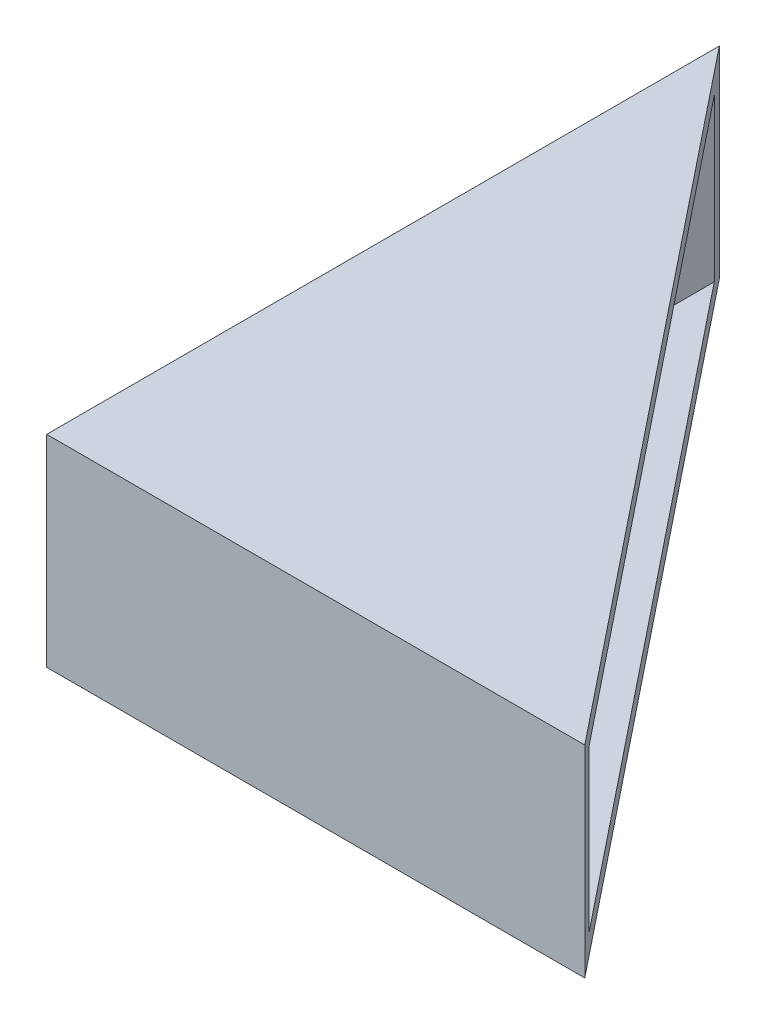
ISO-10303-21;
HEADER;
FILE_DESCRIPTION(('STEP AP214'),'2;1');
FILE_NAME('part.step','',(''),(''),'','','');
FILE_SCHEMA(('AUTOMOTIVE_DESIGN { 1 0 10303 214 1 1 1 1 }'));
ENDSEC;
DATA;
#1=APPLICATION_CONTEXT('core data for automotive mechanical design processes');
#2=APPLICATION_PROTOCOL_DEFINITION('international standard','automotive_design',2000,#1);
#3=PRODUCT_CONTEXT('',#1,'mechanical');
#4=PRODUCT('Part','Part','',(#3));
#5=PRODUCT_RELATED_PRODUCT_CATEGORY('part','',(#4));
#6=PRODUCT_DEFINITION_FORMATION('','',#4);
#7=PRODUCT_DEFINITION_CONTEXT('part definition',#1,'design');
#8=PRODUCT_DEFINITION('design','',#6,#7);
#9=PRODUCT_DEFINITION_SHAPE('','',#8);
#10=(LENGTH_UNIT() NAMED_UNIT(*) SI_UNIT(.MILLI.,.METRE.));
#11=(NAMED_UNIT(*) PLANE_ANGLE_UNIT() SI_UNIT($,.RADIAN.));
#12=(NAMED_UNIT(*) SI_UNIT($,.STERADIAN.) SOLID_ANGLE_UNIT());
#13=UNCERTAINTY_MEASURE_WITH_UNIT(LENGTH_MEASURE(1.E-05),#10,'distance_accuracy_value','');
#14=(GEOMETRIC_REPRESENTATION_CONTEXT(3) GLOBAL_UNCERTAINTY_ASSIGNED_CONTEXT((#13)) GLOBAL_UNIT_ASSIGNED_CONTEXT((#10,
#11,#12)) REPRESENTATION_CONTEXT('',''));
#15=CARTESIAN_POINT('',(0.,0.,0.));
#16=DIRECTION('',(0.,0.,1.));
#17=DIRECTION('',(1.,0.,0.));
#18=AXIS2_PLACEMENT_3D('',#15,#16,#17);
#19=CARTESIAN_POINT('',(80.,30.,0.));
#20=DIRECTION('',(-0.78086880944303,0.,0.624695047554424));
#21=DIRECTION('',(0.624695047554424,0.,0.78086880944303));
#22=AXIS2_PLACEMENT_3D('',#19,#20,#21);
#23=PLANE('',#22);
#24=DIRECTION('',(-0.624695047554424,0.,-0.78086880944303));
#25=VECTOR('',#24,1.);
#26=CARTESIAN_POINT('',(80.,0.,0.));
#27=LINE('',#26,#25);
#28=CARTESIAN_POINT('',(80.,0.,0.));
#29=VERTEX_POINT('',#28);
#30=CARTESIAN_POINT('',(0.,0.,-100.));
#31=VERTEX_POINT('',#30);
#32=EDGE_CURVE('E89',#29,#31,#27,.T.);
#33=ORIENTED_EDGE('',*,*,#32,.T.);
#34=DIRECTION('',(0.,-1.,0.));
#35=VECTOR('',#34,1.);
#36=CARTESIAN_POINT('',(0.,30.,-100.));
#37=LINE('',#36,#35);
#38=CARTESIAN_POINT('',(0.,30.,-100.));
#39=VERTEX_POINT('',#38);
#40=EDGE_CURVE('E155',#39,#31,#37,.T.);
#41=ORIENTED_EDGE('',*,*,#40,.F.);
#42=DIRECTION('',(-0.624695047554424,0.,-0.78086880944303));
#43=VECTOR('',#42,1.);
#44=CARTESIAN_POINT('',(80.,30.,0.));
#45=LINE('',#44,#43);
#46=CARTESIAN_POINT('',(80.,30.,0.));
#47=VERTEX_POINT('',#46);
#48=EDGE_CURVE('E71',#47,#39,#45,.T.);
#49=ORIENTED_EDGE('',*,*,#48,.F.);
#50=DIRECTION('',(0.,-1.,0.));
#51=VECTOR('',#50,1.);
#52=CARTESIAN_POINT('',(80.,30.,0.));
#53=LINE('',#52,#51);
#54=EDGE_CURVE('E57',#47,#29,#53,.T.);
#55=ORIENTED_EDGE('',*,*,#54,.T.);
#56=EDGE_LOOP('',(#33,#41,#49,#55));
#57=FACE_BOUND('',#56,.T.);
#58=DIRECTION('',(-0.624695047554424,0.,-0.78086880944303));
#59=VECTOR('',#58,1.);
#60=CARTESIAN_POINT('',(80.,3.,0.));
#61=LINE('',#60,#59);
#62=CARTESIAN_POINT('',(77.6,3.,-3.));
#63=VERTEX_POINT('',#62);
#64=CARTESIAN_POINT('',(3.,3.,-96.25));
#65=VERTEX_POINT('',#64);
#66=EDGE_CURVE('E121',#63,#65,#61,.T.);
#67=ORIENTED_EDGE('',*,*,#66,.F.);
#68=DIRECTION('',(0.,-1.,0.));
#69=VECTOR('',#68,1.);
#70=CARTESIAN_POINT('',(77.6,30.,-3.));
#71=LINE('',#70,#69);
#72=CARTESIAN_POINT('',(77.6,27.,-3.));
#73=VERTEX_POINT('',#72);
#74=EDGE_CURVE('E117',#73,#63,#71,.T.);
#75=ORIENTED_EDGE('',*,*,#74,.F.);
#76=DIRECTION('',(-0.624695047554424,0.,-0.78086880944303));
#77=VECTOR('',#76,1.);
#78=CARTESIAN_POINT('',(80.,27.,0.));
#79=LINE('',#78,#77);
#80=CARTESIAN_POINT('',(3.,27.,-96.25));
#81=VERTEX_POINT('',#80);
#82=EDGE_CURVE('E63',#73,#81,#79,.T.);
#83=ORIENTED_EDGE('',*,*,#82,.T.);
#84=DIRECTION('',(0.,-1.,0.));
#85=VECTOR('',#84,1.);
#86=CARTESIAN_POINT('',(3.,30.,-96.25));
#87=LINE('',#86,#85);
#88=EDGE_CURVE('E141',#81,#65,#87,.T.);
#89=ORIENTED_EDGE('',*,*,#88,.T.);
#90=EDGE_LOOP('',(#67,#75,#83,#89));
#91=FACE_BOUND('',#90,.T.);
#92=ADVANCED_FACE('F50',(#57,#91),#23,.F.);
#93=CARTESIAN_POINT('',(0.,30.,-100.));
#94=DIRECTION('',(1.,0.,0.));
#95=DIRECTION('',(0.,0.,-1.));
#96=AXIS2_PLACEMENT_3D('',#93,#94,#95);
#97=PLANE('',#96);
#98=CARTESIAN_POINT('',(0.,15.,-15.));
#99=DIRECTION('',(-1.,0.,0.));
#100=DIRECTION('',(0.,0.,1.));
#101=AXIS2_PLACEMENT_3D('',#98,#99,#100);
#102=CIRCLE('',#101,1.75);
#103=CARTESIAN_POINT('',(0.,15.,-13.25));
#104=VERTEX_POINT('',#103);
#105=EDGE_CURVE('E163',#104,#104,#102,.T.);
#106=ORIENTED_EDGE('',*,*,#105,.F.);
#107=EDGE_LOOP('',(#106));
#108=FACE_BOUND('',#107,.T.);
#109=CARTESIAN_POINT('',(0.,15.,-40.));
#110=DIRECTION('',(-1.,0.,0.));
#111=DIRECTION('',(0.,0.,1.));
#112=AXIS2_PLACEMENT_3D('',#109,#110,#111);
#113=CIRCLE('',#112,1.75);
#114=CARTESIAN_POINT('',(0.,15.,-38.25));
#115=VERTEX_POINT('',#114);
#116=EDGE_CURVE('E191',#115,#115,#113,.T.);
#117=ORIENTED_EDGE('',*,*,#116,.F.);
#118=EDGE_LOOP('',(#117));
#119=FACE_BOUND('',#118,.T.);
#120=CARTESIAN_POINT('',(0.,14.9999999999998,-65.));
#121=DIRECTION('',(-1.,0.,0.));
#122=DIRECTION('',(0.,0.,1.));
#123=AXIS2_PLACEMENT_3D('',#120,#121,#122);
#124=CIRCLE('',#123,1.75000000000001);
#125=CARTESIAN_POINT('',(0.,14.9999999999998,-63.25));
#126=VERTEX_POINT('',#125);
#127=EDGE_CURVE('E188',#126,#126,#124,.T.);
#128=ORIENTED_EDGE('',*,*,#127,.F.);
#129=EDGE_LOOP('',(#128));
#130=FACE_BOUND('',#129,.T.);
#131=CARTESIAN_POINT('',(0.,14.9999999999996,-90.));
#132=DIRECTION('',(-1.,0.,0.));
#133=DIRECTION('',(0.,0.,1.));
#134=AXIS2_PLACEMENT_3D('',#131,#132,#133);
#135=CIRCLE('',#134,1.75);
#136=CARTESIAN_POINT('',(0.,14.9999999999996,-88.25));
#137=VERTEX_POINT('',#136);
#138=EDGE_CURVE('E137',#137,#137,#135,.T.);
#139=ORIENTED_EDGE('',*,*,#138,.F.);
#140=EDGE_LOOP('',(#139));
#141=FACE_BOUND('',#140,.T.);
#142=DIRECTION('',(0.,0.,1.));
#143=VECTOR('',#142,1.);
#144=CARTESIAN_POINT('',(0.,0.,-100.));
#145=LINE('',#144,#143);
#146=CARTESIAN_POINT('',(0.,0.,0.));
#147=VERTEX_POINT('',#146);
#148=EDGE_CURVE('E128',#31,#147,#145,.T.);
#149=ORIENTED_EDGE('',*,*,#148,.T.);
#150=DIRECTION('',(0.,-1.,0.));
#151=VECTOR('',#150,1.);
#152=CARTESIAN_POINT('',(0.,30.,0.));
#153=LINE('',#152,#151);
#154=CARTESIAN_POINT('',(0.,30.,0.));
#155=VERTEX_POINT('',#154);
#156=EDGE_CURVE('E11',#155,#147,#153,.T.);
#157=ORIENTED_EDGE('',*,*,#156,.F.);
#158=DIRECTION('',(0.,0.,1.));
#159=VECTOR('',#158,1.);
#160=CARTESIAN_POINT('',(0.,30.,-100.));
#161=LINE('',#160,#159);
#162=EDGE_CURVE('E146',#39,#155,#161,.T.);
#163=ORIENTED_EDGE('',*,*,#162,.F.);
#164=ORIENTED_EDGE('',*,*,#40,.T.);
#165=EDGE_LOOP('',(#149,#157,#163,#164));
#166=FACE_BOUND('',#165,.T.);
#167=ADVANCED_FACE('F47',(#108,#119,#130,#141,#166),#97,.F.);
#168=CARTESIAN_POINT('',(0.,30.,0.));
#169=DIRECTION('',(0.,0.,-1.));
#170=DIRECTION('',(-1.,0.,0.));
#171=AXIS2_PLACEMENT_3D('',#168,#169,#170);
#172=PLANE('',#171);
#173=DIRECTION('',(1.,0.,0.));
#174=VECTOR('',#173,1.);
#175=CARTESIAN_POINT('',(0.,0.,0.));
#176=LINE('',#175,#174);
#177=EDGE_CURVE('E154',#147,#29,#176,.T.);
#178=ORIENTED_EDGE('',*,*,#177,.T.);
#179=ORIENTED_EDGE('',*,*,#54,.F.);
#180=DIRECTION('',(1.,0.,0.));
#181=VECTOR('',#180,1.);
#182=CARTESIAN_POINT('',(0.,30.,0.));
#183=LINE('',#182,#181);
#184=EDGE_CURVE('E92',#155,#47,#183,.T.);
#185=ORIENTED_EDGE('',*,*,#184,.F.);
#186=ORIENTED_EDGE('',*,*,#156,.T.);
#187=EDGE_LOOP('',(#178,#179,#185,#186));
#188=FACE_BOUND('',#187,.T.);
#189=ADVANCED_FACE('F204',(#188),#172,.F.);
#190=CARTESIAN_POINT('',(0.,30.,0.));
#191=DIRECTION('',(0.,1.,0.));
#192=DIRECTION('',(0.,0.,1.));
#193=AXIS2_PLACEMENT_3D('',#190,#191,#192);
#194=PLANE('',#193);
#195=ORIENTED_EDGE('',*,*,#162,.T.);
#196=ORIENTED_EDGE('',*,*,#184,.T.);
#197=ORIENTED_EDGE('',*,*,#48,.T.);
#198=EDGE_LOOP('',(#195,#196,#197));
#199=FACE_BOUND('',#198,.T.);
#200=ADVANCED_FACE('F213',(#199),#194,.T.);
#201=CARTESIAN_POINT('',(0.,0.,0.));
#202=DIRECTION('',(0.,1.,0.));
#203=DIRECTION('',(0.,0.,1.));
#204=AXIS2_PLACEMENT_3D('',#201,#202,#203);
#205=PLANE('',#204);
#206=ORIENTED_EDGE('',*,*,#148,.F.);
#207=ORIENTED_EDGE('',*,*,#32,.F.);
#208=ORIENTED_EDGE('',*,*,#177,.F.);
#209=EDGE_LOOP('',(#206,#207,#208));
#210=FACE_BOUND('',#209,.T.);
#211=ADVANCED_FACE('F173',(#210),#205,.F.);
#212=CARTESIAN_POINT('',(3.,30.,-100.));
#213=DIRECTION('',(1.,0.,0.));
#214=DIRECTION('',(0.,0.,-1.));
#215=AXIS2_PLACEMENT_3D('',#212,#213,#214);
#216=PLANE('',#215);
#217=CARTESIAN_POINT('',(3.,15.,-15.));
#218=DIRECTION('',(1.,0.,0.));
#219=DIRECTION('',(0.,0.,-1.));
#220=AXIS2_PLACEMENT_3D('',#217,#218,#219);
#221=CIRCLE('',#220,1.75);
#222=CARTESIAN_POINT('',(3.,15.,-16.75));
#223=VERTEX_POINT('',#222);
#224=EDGE_CURVE('E51',#223,#223,#221,.T.);
#225=ORIENTED_EDGE('',*,*,#224,.F.);
#226=EDGE_LOOP('',(#225));
#227=FACE_BOUND('',#226,.T.);
#228=CARTESIAN_POINT('',(3.,15.,-40.));
#229=DIRECTION('',(1.,0.,0.));
#230=DIRECTION('',(0.,0.,-1.));
#231=AXIS2_PLACEMENT_3D('',#228,#229,#230);
#232=CIRCLE('',#231,1.75);
#233=CARTESIAN_POINT('',(3.,15.,-41.75));
#234=VERTEX_POINT('',#233);
#235=EDGE_CURVE('E135',#234,#234,#232,.T.);
#236=ORIENTED_EDGE('',*,*,#235,.F.);
#237=EDGE_LOOP('',(#236));
#238=FACE_BOUND('',#237,.T.);
#239=CARTESIAN_POINT('',(3.,14.9999999999998,-65.));
#240=DIRECTION('',(1.,0.,0.));
#241=DIRECTION('',(0.,0.,-1.));
#242=AXIS2_PLACEMENT_3D('',#239,#240,#241);
#243=CIRCLE('',#242,1.75000000000001);
#244=CARTESIAN_POINT('',(3.,14.9999999999998,-66.75));
#245=VERTEX_POINT('',#244);
#246=EDGE_CURVE('E162',#245,#245,#243,.T.);
#247=ORIENTED_EDGE('',*,*,#246,.F.);
#248=EDGE_LOOP('',(#247));
#249=FACE_BOUND('',#248,.T.);
#250=CARTESIAN_POINT('',(3.,14.9999999999996,-90.));
#251=DIRECTION('',(1.,0.,0.));
#252=DIRECTION('',(0.,0.,-1.));
#253=AXIS2_PLACEMENT_3D('',#250,#251,#252);
#254=CIRCLE('',#253,1.75);
#255=CARTESIAN_POINT('',(3.,14.9999999999996,-91.75));
#256=VERTEX_POINT('',#255);
#257=EDGE_CURVE('E159',#256,#256,#254,.T.);
#258=ORIENTED_EDGE('',*,*,#257,.F.);
#259=EDGE_LOOP('',(#258));
#260=FACE_BOUND('',#259,.T.);
#261=DIRECTION('',(0.,0.,1.));
#262=VECTOR('',#261,1.);
#263=CARTESIAN_POINT('',(3.,3.,-100.));
#264=LINE('',#263,#262);
#265=CARTESIAN_POINT('',(3.,3.,-3.));
#266=VERTEX_POINT('',#265);
#267=EDGE_CURVE('E122',#65,#266,#264,.T.);
#268=ORIENTED_EDGE('',*,*,#267,.F.);
#269=ORIENTED_EDGE('',*,*,#88,.F.);
#270=DIRECTION('',(0.,0.,1.));
#271=VECTOR('',#270,1.);
#272=CARTESIAN_POINT('',(3.,27.,-100.));
#273=LINE('',#272,#271);
#274=CARTESIAN_POINT('',(3.,27.,-3.));
#275=VERTEX_POINT('',#274);
#276=EDGE_CURVE('E129',#81,#275,#273,.T.);
#277=ORIENTED_EDGE('',*,*,#276,.T.);
#278=DIRECTION('',(0.,-1.,0.));
#279=VECTOR('',#278,1.);
#280=CARTESIAN_POINT('',(3.,30.,-3.));
#281=LINE('',#280,#279);
#282=EDGE_CURVE('E113',#275,#266,#281,.T.);
#283=ORIENTED_EDGE('',*,*,#282,.T.);
#284=EDGE_LOOP('',(#268,#269,#277,#283));
#285=FACE_BOUND('',#284,.T.);
#286=ADVANCED_FACE('F130',(#227,#238,#249,#260,#285),#216,.T.);
#287=CARTESIAN_POINT('',(0.,30.,-3.));
#288=DIRECTION('',(0.,0.,-1.));
#289=DIRECTION('',(-1.,0.,0.));
#290=AXIS2_PLACEMENT_3D('',#287,#288,#289);
#291=PLANE('',#290);
#292=DIRECTION('',(1.,0.,0.));
#293=VECTOR('',#292,1.);
#294=CARTESIAN_POINT('',(0.,3.,-3.));
#295=LINE('',#294,#293);
#296=EDGE_CURVE('E115',#266,#63,#295,.T.);
#297=ORIENTED_EDGE('',*,*,#296,.F.);
#298=ORIENTED_EDGE('',*,*,#282,.F.);
#299=DIRECTION('',(1.,0.,0.));
#300=VECTOR('',#299,1.);
#301=CARTESIAN_POINT('',(0.,27.,-3.));
#302=LINE('',#301,#300);
#303=EDGE_CURVE('E140',#275,#73,#302,.T.);
#304=ORIENTED_EDGE('',*,*,#303,.T.);
#305=ORIENTED_EDGE('',*,*,#74,.T.);
#306=EDGE_LOOP('',(#297,#298,#304,#305));
#307=FACE_BOUND('',#306,.T.);
#308=ADVANCED_FACE('F111',(#307),#291,.T.);
#309=CARTESIAN_POINT('',(0.,27.,0.));
#310=DIRECTION('',(0.,1.,0.));
#311=DIRECTION('',(0.,0.,1.));
#312=AXIS2_PLACEMENT_3D('',#309,#310,#311);
#313=PLANE('',#312);
#314=ORIENTED_EDGE('',*,*,#276,.F.);
#315=ORIENTED_EDGE('',*,*,#82,.F.);
#316=ORIENTED_EDGE('',*,*,#303,.F.);
#317=EDGE_LOOP('',(#314,#315,#316));
#318=FACE_BOUND('',#317,.T.);
#319=ADVANCED_FACE('F228',(#318),#313,.F.);
#320=CARTESIAN_POINT('',(0.,3.,0.));
#321=DIRECTION('',(0.,1.,0.));
#322=DIRECTION('',(0.,0.,1.));
#323=AXIS2_PLACEMENT_3D('',#320,#321,#322);
#324=PLANE('',#323);
#325=ORIENTED_EDGE('',*,*,#267,.T.);
#326=ORIENTED_EDGE('',*,*,#296,.T.);
#327=ORIENTED_EDGE('',*,*,#66,.T.);
#328=EDGE_LOOP('',(#325,#326,#327));
#329=FACE_BOUND('',#328,.T.);
#330=ADVANCED_FACE('F132',(#329),#324,.T.);
#331=CARTESIAN_POINT('',(10.,14.9999999999996,-90.));
#332=DIRECTION('',(-1.,0.,0.));
#333=DIRECTION('',(0.,0.,1.));
#334=AXIS2_PLACEMENT_3D('',#331,#332,#333);
#335=CYLINDRICAL_SURFACE('',#334,1.75);
#336=ORIENTED_EDGE('',*,*,#257,.T.);
#337=EDGE_LOOP('',(#336));
#338=FACE_BOUND('',#337,.T.);
#339=ORIENTED_EDGE('',*,*,#138,.T.);
#340=EDGE_LOOP('',(#339));
#341=FACE_BOUND('',#340,.T.);
#342=ADVANCED_FACE('F182',(#338,#341),#335,.F.);
#343=CARTESIAN_POINT('',(10.,14.9999999999998,-65.));
#344=DIRECTION('',(-1.,0.,0.));
#345=DIRECTION('',(0.,0.,1.));
#346=AXIS2_PLACEMENT_3D('',#343,#344,#345);
#347=CYLINDRICAL_SURFACE('',#346,1.75000000000001);
#348=ORIENTED_EDGE('',*,*,#246,.T.);
#349=EDGE_LOOP('',(#348));
#350=FACE_BOUND('',#349,.T.);
#351=ORIENTED_EDGE('',*,*,#127,.T.);
#352=EDGE_LOOP('',(#351));
#353=FACE_BOUND('',#352,.T.);
#354=ADVANCED_FACE('F184',(#350,#353),#347,.F.);
#355=CARTESIAN_POINT('',(10.,15.,-40.));
#356=DIRECTION('',(-1.,0.,0.));
#357=DIRECTION('',(0.,0.,1.));
#358=AXIS2_PLACEMENT_3D('',#355,#356,#357);
#359=CYLINDRICAL_SURFACE('',#358,1.75);
#360=ORIENTED_EDGE('',*,*,#235,.T.);
#361=EDGE_LOOP('',(#360));
#362=FACE_BOUND('',#361,.T.);
#363=ORIENTED_EDGE('',*,*,#116,.T.);
#364=EDGE_LOOP('',(#363));
#365=FACE_BOUND('',#364,.T.);
#366=ADVANCED_FACE('F166',(#362,#365),#359,.F.);
#367=CARTESIAN_POINT('',(10.,15.,-15.));
#368=DIRECTION('',(-1.,0.,0.));
#369=DIRECTION('',(0.,0.,1.));
#370=AXIS2_PLACEMENT_3D('',#367,#368,#369);
#371=CYLINDRICAL_SURFACE('',#370,1.75);
#372=ORIENTED_EDGE('',*,*,#224,.T.);
#373=EDGE_LOOP('',(#372));
#374=FACE_BOUND('',#373,.T.);
#375=ORIENTED_EDGE('',*,*,#105,.T.);
#376=EDGE_LOOP('',(#375));
#377=FACE_BOUND('',#376,.T.);
#378=ADVANCED_FACE('F199',(#374,#377),#371,.F.);
#379=CLOSED_SHELL('',(#92,#167,#189,#200,#211,#286,#308,#319,#330,#342,#354,#366,#378));
#380=MANIFOLD_SOLID_BREP('B2',#379);
#381=ADVANCED_BREP_SHAPE_REPRESENTATION('',(#18,#380),#14);
#382=SHAPE_DEFINITION_REPRESENTATION(#9,#381);
ENDSEC;
END-ISO-10303-21;
